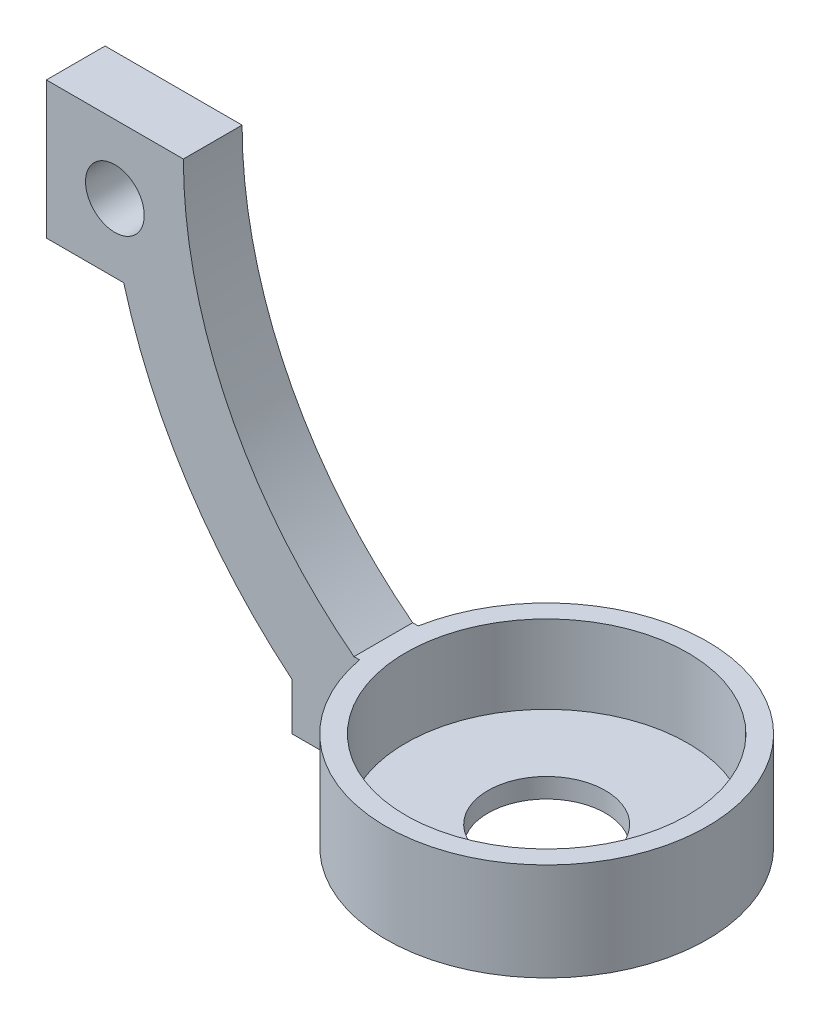
ISO-10303-21;
HEADER;
FILE_DESCRIPTION(('STEP AP214'),'2;1');
FILE_NAME('part.step','',(''),(''),'','','');
FILE_SCHEMA(('AUTOMOTIVE_DESIGN { 1 0 10303 214 1 1 1 1 }'));
ENDSEC;
DATA;
#1=APPLICATION_CONTEXT('core data for automotive mechanical design processes');
#2=APPLICATION_PROTOCOL_DEFINITION('international standard','automotive_design',2000,#1);
#3=PRODUCT_CONTEXT('',#1,'mechanical');
#4=PRODUCT('Part','Part','',(#3));
#5=PRODUCT_RELATED_PRODUCT_CATEGORY('part','',(#4));
#6=PRODUCT_DEFINITION_FORMATION('','',#4);
#7=PRODUCT_DEFINITION_CONTEXT('part definition',#1,'design');
#8=PRODUCT_DEFINITION('design','',#6,#7);
#9=PRODUCT_DEFINITION_SHAPE('','',#8);
#10=(LENGTH_UNIT() NAMED_UNIT(*) SI_UNIT(.MILLI.,.METRE.));
#11=(NAMED_UNIT(*) PLANE_ANGLE_UNIT() SI_UNIT($,.RADIAN.));
#12=(NAMED_UNIT(*) SI_UNIT($,.STERADIAN.) SOLID_ANGLE_UNIT());
#13=UNCERTAINTY_MEASURE_WITH_UNIT(LENGTH_MEASURE(1.E-05),#10,'distance_accuracy_value','');
#14=(GEOMETRIC_REPRESENTATION_CONTEXT(3) GLOBAL_UNCERTAINTY_ASSIGNED_CONTEXT((#13)) GLOBAL_UNIT_ASSIGNED_CONTEXT((#10,
#11,#12)) REPRESENTATION_CONTEXT('',''));
#15=CARTESIAN_POINT('',(0.,0.,0.));
#16=DIRECTION('',(0.,0.,1.));
#17=DIRECTION('',(1.,0.,0.));
#18=AXIS2_PLACEMENT_3D('',#15,#16,#17);
#19=CARTESIAN_POINT('',(4.1,2.5,0.));
#20=DIRECTION('',(0.,1.,0.));
#21=DIRECTION('',(-1.,0.,0.));
#22=AXIS2_PLACEMENT_3D('',#19,#20,#21);
#23=PLANE('',#22);
#24=CARTESIAN_POINT('',(0.,2.5,0.));
#25=DIRECTION('',(0.,-1.,0.));
#26=DIRECTION('',(1.,0.,0.));
#27=AXIS2_PLACEMENT_3D('',#24,#25,#26);
#28=CIRCLE('',#27,3.6);
#29=CARTESIAN_POINT('',(3.6,2.5,0.));
#30=VERTEX_POINT('',#29);
#31=EDGE_CURVE('E170',#30,#30,#28,.T.);
#32=ORIENTED_EDGE('',*,*,#31,.T.);
#33=EDGE_LOOP('',(#32));
#34=FACE_BOUND('',#33,.T.);
#35=DIRECTION('',(1.,0.,0.));
#36=VECTOR('',#35,1.);
#37=CARTESIAN_POINT('',(-2.89913780286485,2.5,-0.75));
#38=LINE('',#37,#36);
#39=CARTESIAN_POINT('',(-4.17284435599485,2.5,-0.75));
#40=VERTEX_POINT('',#39);
#41=CARTESIAN_POINT('',(-4.03081877538547,2.5,-0.75));
#42=VERTEX_POINT('',#41);
#43=EDGE_CURVE('E55',#40,#42,#38,.T.);
#44=ORIENTED_EDGE('',*,*,#43,.F.);
#45=DIRECTION('',(0.,0.,-1.));
#46=VECTOR('',#45,1.);
#47=CARTESIAN_POINT('',(-4.17284435599486,2.5,0.750000000000001));
#48=LINE('',#47,#46);
#49=CARTESIAN_POINT('',(-4.17284435599485,2.5,0.75));
#50=VERTEX_POINT('',#49);
#51=EDGE_CURVE('E59',#50,#40,#48,.T.);
#52=ORIENTED_EDGE('',*,*,#51,.F.);
#53=DIRECTION('',(-1.,0.,0.));
#54=VECTOR('',#53,1.);
#55=CARTESIAN_POINT('',(-2.89913780286485,2.5,0.75));
#56=LINE('',#55,#54);
#57=CARTESIAN_POINT('',(-4.03081877538547,2.5,0.75));
#58=VERTEX_POINT('',#57);
#59=EDGE_CURVE('E152',#58,#50,#56,.T.);
#60=ORIENTED_EDGE('',*,*,#59,.F.);
#61=CARTESIAN_POINT('',(0.,2.5,0.));
#62=DIRECTION('',(0.,-1.,0.));
#63=DIRECTION('',(1.,0.,0.));
#64=AXIS2_PLACEMENT_3D('',#61,#62,#63);
#65=CIRCLE('',#64,4.1);
#66=EDGE_CURVE('E173',#42,#58,#65,.T.);
#67=ORIENTED_EDGE('',*,*,#66,.F.);
#68=EDGE_LOOP('',(#44,#52,#60,#67));
#69=FACE_BOUND('',#68,.T.);
#70=ADVANCED_FACE('F40',(#34,#69),#23,.T.);
#71=CARTESIAN_POINT('',(0.,0.,0.));
#72=DIRECTION('',(0.,-1.,0.));
#73=DIRECTION('',(1.,0.,0.));
#74=AXIS2_PLACEMENT_3D('',#71,#72,#73);
#75=CYLINDRICAL_SURFACE('',#74,1.5);
#76=CARTESIAN_POINT('',(0.,0.,0.));
#77=DIRECTION('',(0.,-1.,0.));
#78=DIRECTION('',(1.,0.,0.));
#79=AXIS2_PLACEMENT_3D('',#76,#77,#78);
#80=CIRCLE('',#79,1.5);
#81=CARTESIAN_POINT('',(1.5,0.,0.));
#82=VERTEX_POINT('',#81);
#83=EDGE_CURVE('E48',#82,#82,#80,.T.);
#84=ORIENTED_EDGE('',*,*,#83,.T.);
#85=EDGE_LOOP('',(#84));
#86=FACE_BOUND('',#85,.T.);
#87=CARTESIAN_POINT('',(0.,0.5,0.));
#88=DIRECTION('',(0.,-1.,0.));
#89=DIRECTION('',(1.,0.,0.));
#90=AXIS2_PLACEMENT_3D('',#87,#88,#89);
#91=CIRCLE('',#90,1.5);
#92=CARTESIAN_POINT('',(1.5,0.5,0.));
#93=VERTEX_POINT('',#92);
#94=EDGE_CURVE('E164',#93,#93,#91,.T.);
#95=ORIENTED_EDGE('',*,*,#94,.F.);
#96=EDGE_LOOP('',(#95));
#97=FACE_BOUND('',#96,.T.);
#98=ADVANCED_FACE('F42',(#86,#97),#75,.F.);
#99=CARTESIAN_POINT('',(1.5,0.,0.));
#100=DIRECTION('',(0.,-1.,0.));
#101=DIRECTION('',(1.,0.,0.));
#102=AXIS2_PLACEMENT_3D('',#99,#100,#101);
#103=PLANE('',#102);
#104=CARTESIAN_POINT('',(0.,0.,0.));
#105=DIRECTION('',(0.,-1.,0.));
#106=DIRECTION('',(1.,0.,0.));
#107=AXIS2_PLACEMENT_3D('',#104,#105,#106);
#108=CIRCLE('',#107,4.1);
#109=CARTESIAN_POINT('',(-4.03081877538547,0.,-0.75));
#110=VERTEX_POINT('',#109);
#111=CARTESIAN_POINT('',(-4.03081877538547,0.,0.75));
#112=VERTEX_POINT('',#111);
#113=EDGE_CURVE('E175',#110,#112,#108,.T.);
#114=ORIENTED_EDGE('',*,*,#113,.T.);
#115=DIRECTION('',(-1.,0.,0.));
#116=VECTOR('',#115,1.);
#117=CARTESIAN_POINT('',(-2.89913780286484,0.,0.75));
#118=LINE('',#117,#116);
#119=CARTESIAN_POINT('',(-5.75,0.,0.75));
#120=VERTEX_POINT('',#119);
#121=EDGE_CURVE('E146',#112,#120,#118,.T.);
#122=ORIENTED_EDGE('',*,*,#121,.T.);
#123=DIRECTION('',(0.,0.,-1.));
#124=VECTOR('',#123,1.);
#125=CARTESIAN_POINT('',(-5.75,0.,-0.75));
#126=LINE('',#125,#124);
#127=CARTESIAN_POINT('',(-5.75,0.,-0.75));
#128=VERTEX_POINT('',#127);
#129=EDGE_CURVE('E138',#120,#128,#126,.T.);
#130=ORIENTED_EDGE('',*,*,#129,.T.);
#131=DIRECTION('',(1.,0.,0.));
#132=VECTOR('',#131,1.);
#133=CARTESIAN_POINT('',(-2.89913780286484,0.,-0.75));
#134=LINE('',#133,#132);
#135=EDGE_CURVE('E141',#128,#110,#134,.T.);
#136=ORIENTED_EDGE('',*,*,#135,.T.);
#137=EDGE_LOOP('',(#114,#122,#130,#136));
#138=FACE_BOUND('',#137,.T.);
#139=ORIENTED_EDGE('',*,*,#83,.F.);
#140=EDGE_LOOP('',(#139));
#141=FACE_BOUND('',#140,.T.);
#142=ADVANCED_FACE('F182',(#138,#141),#103,.T.);
#143=CARTESIAN_POINT('',(0.,0.,0.));
#144=DIRECTION('',(0.,-1.,0.));
#145=DIRECTION('',(1.,0.,0.));
#146=AXIS2_PLACEMENT_3D('',#143,#144,#145);
#147=CYLINDRICAL_SURFACE('',#146,4.1);
#148=DIRECTION('',(0.,-1.,0.));
#149=VECTOR('',#148,1.);
#150=CARTESIAN_POINT('',(-4.03081877538547,0.,-0.75));
#151=LINE('',#150,#149);
#152=EDGE_CURVE('E161',#42,#110,#151,.T.);
#153=ORIENTED_EDGE('',*,*,#152,.F.);
#154=ORIENTED_EDGE('',*,*,#66,.T.);
#155=DIRECTION('',(0.,-1.,0.));
#156=VECTOR('',#155,1.);
#157=CARTESIAN_POINT('',(-4.03081877538547,0.,0.75));
#158=LINE('',#157,#156);
#159=EDGE_CURVE('E158',#112,#58,#158,.F.);
#160=ORIENTED_EDGE('',*,*,#159,.F.);
#161=ORIENTED_EDGE('',*,*,#113,.F.);
#162=EDGE_LOOP('',(#153,#154,#160,#161));
#163=FACE_BOUND('',#162,.T.);
#164=ADVANCED_FACE('F184',(#163),#147,.T.);
#165=CARTESIAN_POINT('',(0.,0.,0.));
#166=DIRECTION('',(0.,-1.,0.));
#167=DIRECTION('',(1.,0.,0.));
#168=AXIS2_PLACEMENT_3D('',#165,#166,#167);
#169=CYLINDRICAL_SURFACE('',#168,3.6);
#170=CARTESIAN_POINT('',(0.,0.5,0.));
#171=DIRECTION('',(0.,-1.,0.));
#172=DIRECTION('',(1.,0.,0.));
#173=AXIS2_PLACEMENT_3D('',#170,#171,#172);
#174=CIRCLE('',#173,3.6);
#175=CARTESIAN_POINT('',(3.6,0.5,0.));
#176=VERTEX_POINT('',#175);
#177=EDGE_CURVE('E167',#176,#176,#174,.T.);
#178=ORIENTED_EDGE('',*,*,#177,.T.);
#179=EDGE_LOOP('',(#178));
#180=FACE_BOUND('',#179,.T.);
#181=ORIENTED_EDGE('',*,*,#31,.F.);
#182=EDGE_LOOP('',(#181));
#183=FACE_BOUND('',#182,.T.);
#184=ADVANCED_FACE('F190',(#180,#183),#169,.F.);
#185=CARTESIAN_POINT('',(3.6,0.5,0.));
#186=DIRECTION('',(0.,1.,0.));
#187=DIRECTION('',(-1.,0.,0.));
#188=AXIS2_PLACEMENT_3D('',#185,#186,#187);
#189=PLANE('',#188);
#190=ORIENTED_EDGE('',*,*,#177,.F.);
#191=EDGE_LOOP('',(#190));
#192=FACE_BOUND('',#191,.T.);
#193=ORIENTED_EDGE('',*,*,#94,.T.);
#194=EDGE_LOOP('',(#193));
#195=FACE_BOUND('',#194,.T.);
#196=ADVANCED_FACE('F201',(#192,#195),#189,.T.);
#197=CARTESIAN_POINT('',(-2.89913780286485,5.72139958202243,-0.75));
#198=DIRECTION('',(0.,0.,-1.));
#199=DIRECTION('',(-1.,0.,0.));
#200=AXIS2_PLACEMENT_3D('',#197,#198,#199);
#201=PLANE('',#200);
#202=CARTESIAN_POINT('',(2.59371199384531,11.33,-0.749999999999999));
#203=DIRECTION('',(0.,0.,1.));
#204=DIRECTION('',(1.,0.,0.));
#205=AXIS2_PLACEMENT_3D('',#202,#203,#204);
#206=CIRCLE('',#205,11.1245307692308);
#207=CARTESIAN_POINT('',(-8.53081877538547,11.33,-0.749999999999999));
#208=VERTEX_POINT('',#207);
#209=EDGE_CURVE('E246',#40,#208,#206,.F.);
#210=ORIENTED_EDGE('',*,*,#209,.F.);
#211=ORIENTED_EDGE('',*,*,#43,.T.);
#212=ORIENTED_EDGE('',*,*,#152,.T.);
#213=ORIENTED_EDGE('',*,*,#135,.F.);
#214=DIRECTION('',(0.,-1.,0.));
#215=VECTOR('',#214,1.);
#216=CARTESIAN_POINT('',(-5.75,5.72139958202243,-0.75));
#217=LINE('',#216,#215);
#218=CARTESIAN_POINT('',(-5.75,1.19906825231523,-0.749999999999999));
#219=VERTEX_POINT('',#218);
#220=EDGE_CURVE('E156',#219,#128,#217,.T.);
#221=ORIENTED_EDGE('',*,*,#220,.F.);
#222=CARTESIAN_POINT('',(2.59371199384531,11.33,-0.749999999999999));
#223=DIRECTION('',(0.,0.,1.));
#224=DIRECTION('',(1.,0.,0.));
#225=AXIS2_PLACEMENT_3D('',#222,#223,#224);
#226=CIRCLE('',#225,13.1245307692308);
#227=CARTESIAN_POINT('',(-10.0555294028743,7.83,-0.749999999999999));
#228=VERTEX_POINT('',#227);
#229=EDGE_CURVE('E260',#219,#228,#226,.F.);
#230=ORIENTED_EDGE('',*,*,#229,.T.);
#231=DIRECTION('',(1.,0.,0.));
#232=VECTOR('',#231,1.);
#233=CARTESIAN_POINT('',(0.,7.83000000000002,-0.749999999999999));
#234=LINE('',#233,#232);
#235=CARTESIAN_POINT('',(-12.0308187753855,7.83,-0.749999999999999));
#236=VERTEX_POINT('',#235);
#237=EDGE_CURVE('E261',#236,#228,#234,.T.);
#238=ORIENTED_EDGE('',*,*,#237,.F.);
#239=DIRECTION('',(0.,-1.,0.));
#240=VECTOR('',#239,1.);
#241=CARTESIAN_POINT('',(-12.0308187753855,0.,-0.749999999999999));
#242=LINE('',#241,#240);
#243=CARTESIAN_POINT('',(-12.0308187753855,11.33,-0.749999999999999));
#244=VERTEX_POINT('',#243);
#245=EDGE_CURVE('E137',#244,#236,#242,.T.);
#246=ORIENTED_EDGE('',*,*,#245,.F.);
#247=DIRECTION('',(-1.,0.,0.));
#248=VECTOR('',#247,1.);
#249=CARTESIAN_POINT('',(0.,11.33,-0.749999999999999));
#250=LINE('',#249,#248);
#251=EDGE_CURVE('E244',#208,#244,#250,.T.);
#252=ORIENTED_EDGE('',*,*,#251,.F.);
#253=EDGE_LOOP('',(#210,#211,#212,#213,#221,#230,#238,#246,#252));
#254=FACE_BOUND('',#253,.T.);
#255=CARTESIAN_POINT('',(-10.2808187753855,9.58,-0.749999999999999));
#256=DIRECTION('',(0.,0.,1.));
#257=DIRECTION('',(1.,0.,0.));
#258=AXIS2_PLACEMENT_3D('',#255,#256,#257);
#259=CIRCLE('',#258,0.75);
#260=CARTESIAN_POINT('',(-9.53081877538547,9.58,-0.749999999999999));
#261=VERTEX_POINT('',#260);
#262=EDGE_CURVE('E133',#261,#261,#259,.T.);
#263=ORIENTED_EDGE('',*,*,#262,.T.);
#264=EDGE_LOOP('',(#263));
#265=FACE_BOUND('',#264,.T.);
#266=ADVANCED_FACE('F205',(#254,#265),#201,.T.);
#267=CARTESIAN_POINT('',(-2.89913780286485,5.72139958202243,0.75));
#268=DIRECTION('',(0.,0.,1.));
#269=DIRECTION('',(1.,0.,0.));
#270=AXIS2_PLACEMENT_3D('',#267,#268,#269);
#271=PLANE('',#270);
#272=ORIENTED_EDGE('',*,*,#59,.T.);
#273=CARTESIAN_POINT('',(2.59371199384531,11.33,0.750000000000001));
#274=DIRECTION('',(0.,0.,1.));
#275=DIRECTION('',(1.,0.,0.));
#276=AXIS2_PLACEMENT_3D('',#273,#274,#275);
#277=CIRCLE('',#276,11.1245307692308);
#278=CARTESIAN_POINT('',(-8.53081877538547,11.33,0.750000000000001));
#279=VERTEX_POINT('',#278);
#280=EDGE_CURVE('E257',#50,#279,#277,.F.);
#281=ORIENTED_EDGE('',*,*,#280,.T.);
#282=DIRECTION('',(-1.,0.,0.));
#283=VECTOR('',#282,1.);
#284=CARTESIAN_POINT('',(0.,11.33,0.750000000000001));
#285=LINE('',#284,#283);
#286=CARTESIAN_POINT('',(-12.0308187753855,11.33,0.750000000000001));
#287=VERTEX_POINT('',#286);
#288=EDGE_CURVE('E129',#279,#287,#285,.T.);
#289=ORIENTED_EDGE('',*,*,#288,.T.);
#290=DIRECTION('',(0.,-1.,0.));
#291=VECTOR('',#290,1.);
#292=CARTESIAN_POINT('',(-12.0308187753855,0.,0.750000000000001));
#293=LINE('',#292,#291);
#294=CARTESIAN_POINT('',(-12.0308187753855,7.83,0.750000000000001));
#295=VERTEX_POINT('',#294);
#296=EDGE_CURVE('E123',#287,#295,#293,.T.);
#297=ORIENTED_EDGE('',*,*,#296,.T.);
#298=DIRECTION('',(1.,0.,0.));
#299=VECTOR('',#298,1.);
#300=CARTESIAN_POINT('',(0.,7.83000000000002,0.750000000000001));
#301=LINE('',#300,#299);
#302=CARTESIAN_POINT('',(-10.0555294028743,7.83,0.750000000000001));
#303=VERTEX_POINT('',#302);
#304=EDGE_CURVE('E111',#295,#303,#301,.T.);
#305=ORIENTED_EDGE('',*,*,#304,.T.);
#306=CARTESIAN_POINT('',(2.59371199384531,11.33,0.750000000000001));
#307=DIRECTION('',(0.,0.,1.));
#308=DIRECTION('',(1.,0.,0.));
#309=AXIS2_PLACEMENT_3D('',#306,#307,#308);
#310=CIRCLE('',#309,13.1245307692308);
#311=CARTESIAN_POINT('',(-5.75,1.19906825231523,0.75));
#312=VERTEX_POINT('',#311);
#313=EDGE_CURVE('E122',#312,#303,#310,.F.);
#314=ORIENTED_EDGE('',*,*,#313,.F.);
#315=DIRECTION('',(0.,-1.,0.));
#316=VECTOR('',#315,1.);
#317=CARTESIAN_POINT('',(-5.75,5.72139958202243,0.75));
#318=LINE('',#317,#316);
#319=EDGE_CURVE('E154',#312,#120,#318,.T.);
#320=ORIENTED_EDGE('',*,*,#319,.T.);
#321=ORIENTED_EDGE('',*,*,#121,.F.);
#322=ORIENTED_EDGE('',*,*,#159,.T.);
#323=EDGE_LOOP('',(#272,#281,#289,#297,#305,#314,#320,#321,#322));
#324=FACE_BOUND('',#323,.T.);
#325=CARTESIAN_POINT('',(-10.2808187753855,9.58,0.750000000000001));
#326=DIRECTION('',(0.,0.,1.));
#327=DIRECTION('',(1.,0.,0.));
#328=AXIS2_PLACEMENT_3D('',#325,#326,#327);
#329=CIRCLE('',#328,0.75);
#330=CARTESIAN_POINT('',(-9.53081877538547,9.58,0.750000000000001));
#331=VERTEX_POINT('',#330);
#332=EDGE_CURVE('E240',#331,#331,#329,.T.);
#333=ORIENTED_EDGE('',*,*,#332,.F.);
#334=EDGE_LOOP('',(#333));
#335=FACE_BOUND('',#334,.T.);
#336=ADVANCED_FACE('F126',(#324,#335),#271,.T.);
#337=CARTESIAN_POINT('',(-5.75,5.72139958202243,-0.75));
#338=DIRECTION('',(-1.,0.,0.));
#339=DIRECTION('',(0.,-1.,0.));
#340=AXIS2_PLACEMENT_3D('',#337,#338,#339);
#341=PLANE('',#340);
#342=DIRECTION('',(0.,0.,-1.));
#343=VECTOR('',#342,1.);
#344=CARTESIAN_POINT('',(-5.75,1.19906825231523,0.750000000000001));
#345=LINE('',#344,#343);
#346=EDGE_CURVE('E11',#219,#312,#345,.F.);
#347=ORIENTED_EDGE('',*,*,#346,.F.);
#348=ORIENTED_EDGE('',*,*,#220,.T.);
#349=ORIENTED_EDGE('',*,*,#129,.F.);
#350=ORIENTED_EDGE('',*,*,#319,.F.);
#351=EDGE_LOOP('',(#347,#348,#349,#350));
#352=FACE_BOUND('',#351,.T.);
#353=ADVANCED_FACE('F212',(#352),#341,.T.);
#354=CARTESIAN_POINT('',(-12.0308187753855,0.,0.750000000000001));
#355=DIRECTION('',(1.,0.,0.));
#356=DIRECTION('',(0.,0.,-1.));
#357=AXIS2_PLACEMENT_3D('',#354,#355,#356);
#358=PLANE('',#357);
#359=ORIENTED_EDGE('',*,*,#245,.T.);
#360=DIRECTION('',(0.,0.,-1.));
#361=VECTOR('',#360,1.);
#362=CARTESIAN_POINT('',(-12.0308187753855,7.83,0.750000000000001));
#363=LINE('',#362,#361);
#364=EDGE_CURVE('E116',#295,#236,#363,.T.);
#365=ORIENTED_EDGE('',*,*,#364,.F.);
#366=ORIENTED_EDGE('',*,*,#296,.F.);
#367=DIRECTION('',(0.,0.,-1.));
#368=VECTOR('',#367,1.);
#369=CARTESIAN_POINT('',(-12.0308187753855,11.33,0.750000000000001));
#370=LINE('',#369,#368);
#371=EDGE_CURVE('E250',#287,#244,#370,.T.);
#372=ORIENTED_EDGE('',*,*,#371,.T.);
#373=EDGE_LOOP('',(#359,#365,#366,#372));
#374=FACE_BOUND('',#373,.T.);
#375=ADVANCED_FACE('F135',(#374),#358,.F.);
#376=CARTESIAN_POINT('',(0.,7.83000000000002,0.750000000000001));
#377=DIRECTION('',(0.,1.,0.));
#378=DIRECTION('',(-1.,0.,0.));
#379=AXIS2_PLACEMENT_3D('',#376,#377,#378);
#380=PLANE('',#379);
#381=ORIENTED_EDGE('',*,*,#237,.T.);
#382=DIRECTION('',(0.,0.,-1.));
#383=VECTOR('',#382,1.);
#384=CARTESIAN_POINT('',(-10.0555294028743,7.83,0.750000000000001));
#385=LINE('',#384,#383);
#386=EDGE_CURVE('E119',#303,#228,#385,.T.);
#387=ORIENTED_EDGE('',*,*,#386,.F.);
#388=ORIENTED_EDGE('',*,*,#304,.F.);
#389=ORIENTED_EDGE('',*,*,#364,.T.);
#390=EDGE_LOOP('',(#381,#387,#388,#389));
#391=FACE_BOUND('',#390,.T.);
#392=ADVANCED_FACE('F114',(#391),#380,.F.);
#393=CARTESIAN_POINT('',(2.59371199384531,11.33,0.750000000000001));
#394=DIRECTION('',(0.,0.,-1.));
#395=DIRECTION('',(-1.,0.,0.));
#396=AXIS2_PLACEMENT_3D('',#393,#394,#395);
#397=CYLINDRICAL_SURFACE('',#396,13.1245307692308);
#398=ORIENTED_EDGE('',*,*,#229,.F.);
#399=ORIENTED_EDGE('',*,*,#346,.T.);
#400=ORIENTED_EDGE('',*,*,#313,.T.);
#401=ORIENTED_EDGE('',*,*,#386,.T.);
#402=EDGE_LOOP('',(#398,#399,#400,#401));
#403=FACE_BOUND('',#402,.T.);
#404=ADVANCED_FACE('F220',(#403),#397,.T.);
#405=CARTESIAN_POINT('',(2.59371199384531,11.33,0.750000000000001));
#406=DIRECTION('',(0.,0.,-1.));
#407=DIRECTION('',(-1.,0.,0.));
#408=AXIS2_PLACEMENT_3D('',#405,#406,#407);
#409=CYLINDRICAL_SURFACE('',#408,11.1245307692308);
#410=ORIENTED_EDGE('',*,*,#209,.T.);
#411=DIRECTION('',(0.,0.,-1.));
#412=VECTOR('',#411,1.);
#413=CARTESIAN_POINT('',(-8.53081877538547,11.33,0.750000000000001));
#414=LINE('',#413,#412);
#415=EDGE_CURVE('E252',#279,#208,#414,.T.);
#416=ORIENTED_EDGE('',*,*,#415,.F.);
#417=ORIENTED_EDGE('',*,*,#280,.F.);
#418=ORIENTED_EDGE('',*,*,#51,.T.);
#419=EDGE_LOOP('',(#410,#416,#417,#418));
#420=FACE_BOUND('',#419,.T.);
#421=ADVANCED_FACE('F223',(#420),#409,.F.);
#422=CARTESIAN_POINT('',(0.,11.33,0.750000000000001));
#423=DIRECTION('',(0.,-1.,0.));
#424=DIRECTION('',(1.,0.,0.));
#425=AXIS2_PLACEMENT_3D('',#422,#423,#424);
#426=PLANE('',#425);
#427=ORIENTED_EDGE('',*,*,#251,.T.);
#428=ORIENTED_EDGE('',*,*,#371,.F.);
#429=ORIENTED_EDGE('',*,*,#288,.F.);
#430=ORIENTED_EDGE('',*,*,#415,.T.);
#431=EDGE_LOOP('',(#427,#428,#429,#430));
#432=FACE_BOUND('',#431,.T.);
#433=ADVANCED_FACE('F227',(#432),#426,.F.);
#434=CARTESIAN_POINT('',(-10.2808187753855,9.58,0.750000000000001));
#435=DIRECTION('',(0.,0.,-1.));
#436=DIRECTION('',(-1.,0.,0.));
#437=AXIS2_PLACEMENT_3D('',#434,#435,#436);
#438=CYLINDRICAL_SURFACE('',#437,0.75);
#439=ORIENTED_EDGE('',*,*,#332,.T.);
#440=EDGE_LOOP('',(#439));
#441=FACE_BOUND('',#440,.T.);
#442=ORIENTED_EDGE('',*,*,#262,.F.);
#443=EDGE_LOOP('',(#442));
#444=FACE_BOUND('',#443,.T.);
#445=ADVANCED_FACE('F231',(#441,#444),#438,.F.);
#446=CLOSED_SHELL('',(#70,#98,#142,#164,#184,#196,#266,#336,#353,#375,#392,#404,#421,#433,#445));
#447=MANIFOLD_SOLID_BREP('B2',#446);
#448=ADVANCED_BREP_SHAPE_REPRESENTATION('',(#18,#447),#14);
#449=SHAPE_DEFINITION_REPRESENTATION(#9,#448);
ENDSEC;
END-ISO-10303-21;
